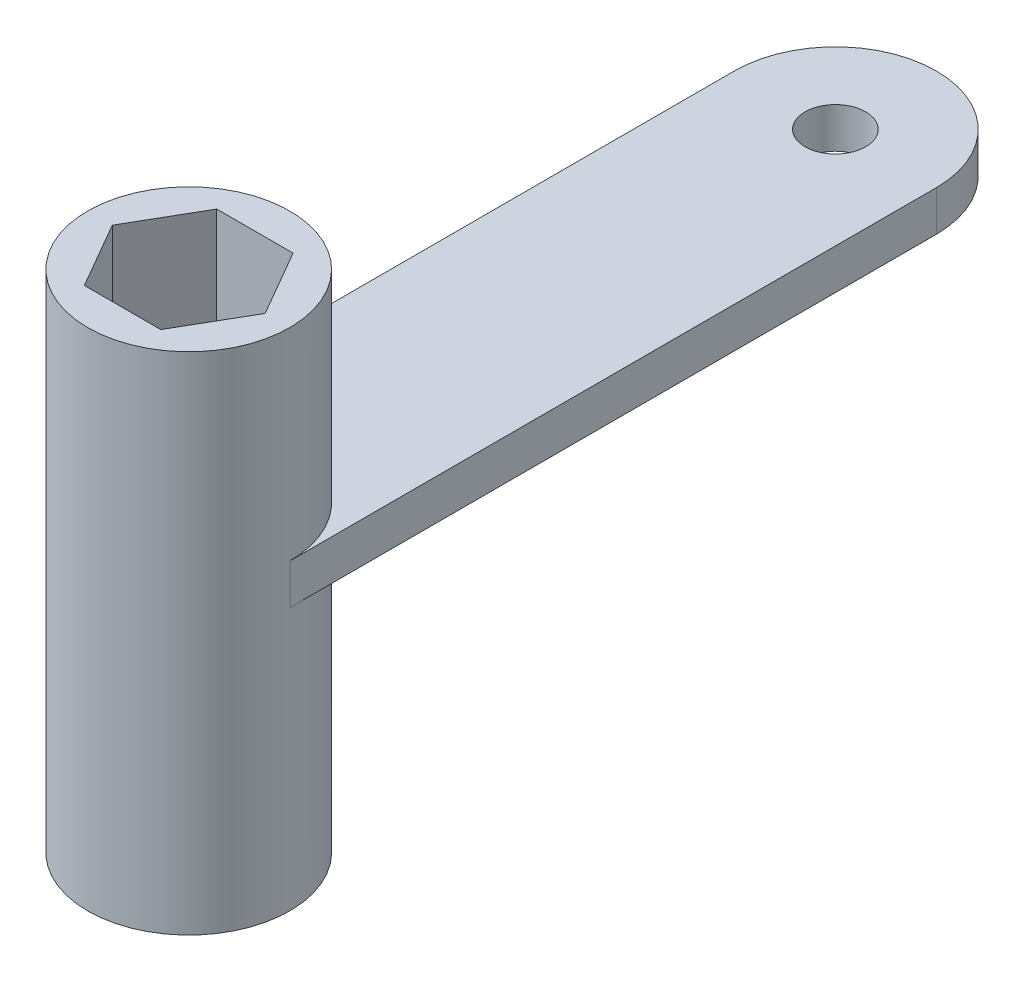
ISO-10303-21;
HEADER;
FILE_DESCRIPTION(('STEP AP214'),'2;1');
FILE_NAME('part.step','',(''),(''),'','','');
FILE_SCHEMA(('AUTOMOTIVE_DESIGN { 1 0 10303 214 1 1 1 1 }'));
ENDSEC;
DATA;
#1=APPLICATION_CONTEXT('core data for automotive mechanical design processes');
#2=APPLICATION_PROTOCOL_DEFINITION('international standard','automotive_design',2000,#1);
#3=PRODUCT_CONTEXT('',#1,'mechanical');
#4=PRODUCT('Part','Part','',(#3));
#5=PRODUCT_RELATED_PRODUCT_CATEGORY('part','',(#4));
#6=PRODUCT_DEFINITION_FORMATION('','',#4);
#7=PRODUCT_DEFINITION_CONTEXT('part definition',#1,'design');
#8=PRODUCT_DEFINITION('design','',#6,#7);
#9=PRODUCT_DEFINITION_SHAPE('','',#8);
#10=(LENGTH_UNIT() NAMED_UNIT(*) SI_UNIT(.MILLI.,.METRE.));
#11=(NAMED_UNIT(*) PLANE_ANGLE_UNIT() SI_UNIT($,.RADIAN.));
#12=(NAMED_UNIT(*) SI_UNIT($,.STERADIAN.) SOLID_ANGLE_UNIT());
#13=UNCERTAINTY_MEASURE_WITH_UNIT(LENGTH_MEASURE(1.E-05),#10,'distance_accuracy_value','');
#14=(GEOMETRIC_REPRESENTATION_CONTEXT(3) GLOBAL_UNCERTAINTY_ASSIGNED_CONTEXT((#13)) GLOBAL_UNIT_ASSIGNED_CONTEXT((#10,
#11,#12)) REPRESENTATION_CONTEXT('',''));
#15=CARTESIAN_POINT('',(0.,0.,0.));
#16=DIRECTION('',(0.,0.,1.));
#17=DIRECTION('',(1.,0.,0.));
#18=AXIS2_PLACEMENT_3D('',#15,#16,#17);
#19=CARTESIAN_POINT('',(3.78164426319206,2.,16.));
#20=DIRECTION('',(-0.866025403784439,0.,0.5));
#21=DIRECTION('',(0.5,0.,0.866025403784439));
#22=AXIS2_PLACEMENT_3D('',#19,#20,#21);
#23=PLANE('',#22);
#24=DIRECTION('',(0.,-1.,0.));
#25=VECTOR('',#24,1.);
#26=CARTESIAN_POINT('',(1.89082213159603,2.,12.725));
#27=LINE('',#26,#25);
#28=CARTESIAN_POINT('',(1.89082213159603,12.,12.725));
#29=VERTEX_POINT('',#28);
#30=CARTESIAN_POINT('',(1.89082213159603,-5.2,12.725));
#31=VERTEX_POINT('',#30);
#32=EDGE_CURVE('E140',#29,#31,#27,.T.);
#33=ORIENTED_EDGE('',*,*,#32,.T.);
#34=DIRECTION('',(-0.5,0.,-0.866025403784439));
#35=VECTOR('',#34,1.);
#36=CARTESIAN_POINT('',(-4.09197003288147,-5.2,2.3625));
#37=LINE('',#36,#35);
#38=CARTESIAN_POINT('',(3.78164426319206,-5.2,16.));
#39=VERTEX_POINT('',#38);
#40=EDGE_CURVE('E125',#39,#31,#37,.T.);
#41=ORIENTED_EDGE('',*,*,#40,.F.);
#42=DIRECTION('',(0.,-1.,0.));
#43=VECTOR('',#42,1.);
#44=CARTESIAN_POINT('',(3.78164426319206,2.,16.));
#45=LINE('',#44,#43);
#46=CARTESIAN_POINT('',(3.78164426319206,12.,16.));
#47=VERTEX_POINT('',#46);
#48=EDGE_CURVE('E208',#47,#39,#45,.T.);
#49=ORIENTED_EDGE('',*,*,#48,.F.);
#50=DIRECTION('',(-0.5,0.,-0.866025403784439));
#51=VECTOR('',#50,1.);
#52=CARTESIAN_POINT('',(3.78164426319206,12.,16.));
#53=LINE('',#52,#51);
#54=EDGE_CURVE('E147',#47,#29,#53,.T.);
#55=ORIENTED_EDGE('',*,*,#54,.T.);
#56=EDGE_LOOP('',(#33,#41,#49,#55));
#57=FACE_BOUND('',#56,.T.);
#58=ADVANCED_FACE('F39',(#57),#23,.T.);
#59=CARTESIAN_POINT('',(1.89082213159603,2.,12.725));
#60=DIRECTION('',(0.,0.,1.));
#61=DIRECTION('',(1.,0.,0.));
#62=AXIS2_PLACEMENT_3D('',#59,#60,#61);
#63=PLANE('',#62);
#64=DIRECTION('',(0.,-1.,0.));
#65=VECTOR('',#64,1.);
#66=CARTESIAN_POINT('',(-1.89082213159602,2.,12.725));
#67=LINE('',#66,#65);
#68=CARTESIAN_POINT('',(-1.89082213159602,12.,12.725));
#69=VERTEX_POINT('',#68);
#70=CARTESIAN_POINT('',(-1.89082213159602,-5.2,12.725));
#71=VERTEX_POINT('',#70);
#72=EDGE_CURVE('E142',#69,#71,#67,.T.);
#73=ORIENTED_EDGE('',*,*,#72,.T.);
#74=DIRECTION('',(-1.,0.,0.));
#75=VECTOR('',#74,1.);
#76=CARTESIAN_POINT('',(0.,-5.2,12.725));
#77=LINE('',#76,#75);
#78=EDGE_CURVE('E128',#31,#71,#77,.T.);
#79=ORIENTED_EDGE('',*,*,#78,.F.);
#80=ORIENTED_EDGE('',*,*,#32,.F.);
#81=DIRECTION('',(-1.,0.,0.));
#82=VECTOR('',#81,1.);
#83=CARTESIAN_POINT('',(1.89082213159603,12.,12.725));
#84=LINE('',#83,#82);
#85=EDGE_CURVE('E258',#29,#69,#84,.T.);
#86=ORIENTED_EDGE('',*,*,#85,.T.);
#87=EDGE_LOOP('',(#73,#79,#80,#86));
#88=FACE_BOUND('',#87,.T.);
#89=ADVANCED_FACE('F138',(#88),#63,.T.);
#90=CARTESIAN_POINT('',(-1.89082213159602,2.,12.725));
#91=DIRECTION('',(0.866025403784439,0.,0.5));
#92=DIRECTION('',(0.5,0.,-0.866025403784439));
#93=AXIS2_PLACEMENT_3D('',#90,#91,#92);
#94=PLANE('',#93);
#95=DIRECTION('',(0.,-1.,0.));
#96=VECTOR('',#95,1.);
#97=CARTESIAN_POINT('',(-3.78164426319204,2.,16.));
#98=LINE('',#97,#96);
#99=CARTESIAN_POINT('',(-3.78164426319204,12.,16.));
#100=VERTEX_POINT('',#99);
#101=CARTESIAN_POINT('',(-3.78164426319204,-5.2,16.));
#102=VERTEX_POINT('',#101);
#103=EDGE_CURVE('E157',#100,#102,#98,.T.);
#104=ORIENTED_EDGE('',*,*,#103,.T.);
#105=DIRECTION('',(-0.5,0.,0.866025403784439));
#106=VECTOR('',#105,1.);
#107=CARTESIAN_POINT('',(4.09197003288147,-5.2,2.3625));
#108=LINE('',#107,#106);
#109=EDGE_CURVE('E228',#71,#102,#108,.T.);
#110=ORIENTED_EDGE('',*,*,#109,.F.);
#111=ORIENTED_EDGE('',*,*,#72,.F.);
#112=DIRECTION('',(-0.5,0.,0.866025403784439));
#113=VECTOR('',#112,1.);
#114=CARTESIAN_POINT('',(-1.89082213159602,12.,12.725));
#115=LINE('',#114,#113);
#116=EDGE_CURVE('E230',#69,#100,#115,.T.);
#117=ORIENTED_EDGE('',*,*,#116,.T.);
#118=EDGE_LOOP('',(#104,#110,#111,#117));
#119=FACE_BOUND('',#118,.T.);
#120=ADVANCED_FACE('F227',(#119),#94,.T.);
#121=CARTESIAN_POINT('',(-3.78164426319204,2.,16.));
#122=DIRECTION('',(0.866025403784439,0.,-0.5));
#123=DIRECTION('',(-0.5,0.,-0.866025403784438));
#124=AXIS2_PLACEMENT_3D('',#121,#122,#123);
#125=PLANE('',#124);
#126=DIRECTION('',(0.,-1.,0.));
#127=VECTOR('',#126,1.);
#128=CARTESIAN_POINT('',(-1.89082213159602,2.,19.275));
#129=LINE('',#128,#127);
#130=CARTESIAN_POINT('',(-1.89082213159602,12.,19.275));
#131=VERTEX_POINT('',#130);
#132=CARTESIAN_POINT('',(-1.89082213159602,-5.2,19.275));
#133=VERTEX_POINT('',#132);
#134=EDGE_CURVE('E220',#131,#133,#129,.T.);
#135=ORIENTED_EDGE('',*,*,#134,.T.);
#136=DIRECTION('',(0.5,0.,0.866025403784439));
#137=VECTOR('',#136,1.);
#138=CARTESIAN_POINT('',(-9.76443642766954,-5.2,5.6375));
#139=LINE('',#138,#137);
#140=EDGE_CURVE('E237',#102,#133,#139,.T.);
#141=ORIENTED_EDGE('',*,*,#140,.F.);
#142=ORIENTED_EDGE('',*,*,#103,.F.);
#143=DIRECTION('',(0.5,0.,0.866025403784438));
#144=VECTOR('',#143,1.);
#145=CARTESIAN_POINT('',(-3.78164426319204,12.,16.));
#146=LINE('',#145,#144);
#147=EDGE_CURVE('E211',#100,#131,#146,.T.);
#148=ORIENTED_EDGE('',*,*,#147,.T.);
#149=EDGE_LOOP('',(#135,#141,#142,#148));
#150=FACE_BOUND('',#149,.T.);
#151=ADVANCED_FACE('F235',(#150),#125,.T.);
#152=CARTESIAN_POINT('',(-1.89082213159602,2.,19.275));
#153=DIRECTION('',(0.,0.,-1.));
#154=DIRECTION('',(-1.,0.,0.));
#155=AXIS2_PLACEMENT_3D('',#152,#153,#154);
#156=PLANE('',#155);
#157=DIRECTION('',(0.,-1.,0.));
#158=VECTOR('',#157,1.);
#159=CARTESIAN_POINT('',(1.89082213159603,2.,19.275));
#160=LINE('',#159,#158);
#161=CARTESIAN_POINT('',(1.89082213159603,12.,19.275));
#162=VERTEX_POINT('',#161);
#163=CARTESIAN_POINT('',(1.89082213159603,-5.2,19.275));
#164=VERTEX_POINT('',#163);
#165=EDGE_CURVE('E216',#162,#164,#160,.T.);
#166=ORIENTED_EDGE('',*,*,#165,.T.);
#167=DIRECTION('',(1.,0.,0.));
#168=VECTOR('',#167,1.);
#169=CARTESIAN_POINT('',(0.,-5.2,19.275));
#170=LINE('',#169,#168);
#171=EDGE_CURVE('E55',#133,#164,#170,.T.);
#172=ORIENTED_EDGE('',*,*,#171,.F.);
#173=ORIENTED_EDGE('',*,*,#134,.F.);
#174=DIRECTION('',(1.,0.,0.));
#175=VECTOR('',#174,1.);
#176=CARTESIAN_POINT('',(-1.89082213159602,12.,19.275));
#177=LINE('',#176,#175);
#178=EDGE_CURVE('E203',#131,#162,#177,.T.);
#179=ORIENTED_EDGE('',*,*,#178,.T.);
#180=EDGE_LOOP('',(#166,#172,#173,#179));
#181=FACE_BOUND('',#180,.T.);
#182=ADVANCED_FACE('F268',(#181),#156,.T.);
#183=CARTESIAN_POINT('',(1.89082213159603,2.,19.275));
#184=DIRECTION('',(-0.866025403784439,0.,-0.5));
#185=DIRECTION('',(-0.5,0.,0.866025403784439));
#186=AXIS2_PLACEMENT_3D('',#183,#184,#185);
#187=PLANE('',#186);
#188=ORIENTED_EDGE('',*,*,#48,.T.);
#189=DIRECTION('',(0.5,0.,-0.866025403784439));
#190=VECTOR('',#189,1.);
#191=CARTESIAN_POINT('',(9.76443642766955,-5.2,5.6375));
#192=LINE('',#191,#190);
#193=EDGE_CURVE('E130',#164,#39,#192,.T.);
#194=ORIENTED_EDGE('',*,*,#193,.F.);
#195=ORIENTED_EDGE('',*,*,#165,.F.);
#196=DIRECTION('',(0.5,0.,-0.866025403784439));
#197=VECTOR('',#196,1.);
#198=CARTESIAN_POINT('',(1.89082213159603,12.,19.275));
#199=LINE('',#198,#197);
#200=EDGE_CURVE('E252',#162,#47,#199,.T.);
#201=ORIENTED_EDGE('',*,*,#200,.T.);
#202=EDGE_LOOP('',(#188,#194,#195,#201));
#203=FACE_BOUND('',#202,.T.);
#204=ADVANCED_FACE('F270',(#203),#187,.T.);
#205=CARTESIAN_POINT('',(0.,2.,16.));
#206=DIRECTION('',(0.,1.,0.));
#207=DIRECTION('',(0.,0.,1.));
#208=AXIS2_PLACEMENT_3D('',#205,#206,#207);
#209=PLANE('',#208);
#210=CARTESIAN_POINT('',(0.,2.,16.));
#211=DIRECTION('',(0.,1.,0.));
#212=DIRECTION('',(0.,0.,1.));
#213=AXIS2_PLACEMENT_3D('',#210,#211,#212);
#214=CIRCLE('',#213,4.99999999999999);
#215=CARTESIAN_POINT('',(4.99999999999999,2.,16.));
#216=VERTEX_POINT('',#215);
#217=CARTESIAN_POINT('',(-4.99999999999999,2.,16.));
#218=VERTEX_POINT('',#217);
#219=EDGE_CURVE('E200',#216,#218,#214,.T.);
#220=ORIENTED_EDGE('',*,*,#219,.F.);
#221=DIRECTION('',(0.,0.,-1.));
#222=VECTOR('',#221,1.);
#223=CARTESIAN_POINT('',(4.99999999999999,2.,16.));
#224=LINE('',#223,#222);
#225=CARTESIAN_POINT('',(4.99999999999999,2.,-16.));
#226=VERTEX_POINT('',#225);
#227=EDGE_CURVE('E86',#216,#226,#224,.T.);
#228=ORIENTED_EDGE('',*,*,#227,.T.);
#229=CARTESIAN_POINT('',(0.,2.,-16.));
#230=DIRECTION('',(0.,1.,0.));
#231=DIRECTION('',(0.,0.,1.));
#232=AXIS2_PLACEMENT_3D('',#229,#230,#231);
#233=CIRCLE('',#232,4.99999999999999);
#234=CARTESIAN_POINT('',(-5.,2.,-16.));
#235=VERTEX_POINT('',#234);
#236=EDGE_CURVE('E167',#226,#235,#233,.T.);
#237=ORIENTED_EDGE('',*,*,#236,.T.);
#238=DIRECTION('',(0.,0.,1.));
#239=VECTOR('',#238,1.);
#240=CARTESIAN_POINT('',(-4.99999999999999,2.,16.));
#241=LINE('',#240,#239);
#242=EDGE_CURVE('E64',#235,#218,#241,.T.);
#243=ORIENTED_EDGE('',*,*,#242,.T.);
#244=EDGE_LOOP('',(#220,#228,#237,#243));
#245=FACE_BOUND('',#244,.T.);
#246=CARTESIAN_POINT('',(0.,2.,-16.));
#247=DIRECTION('',(0.,1.,0.));
#248=DIRECTION('',(0.,0.,1.));
#249=AXIS2_PLACEMENT_3D('',#246,#247,#248);
#250=CIRCLE('',#249,1.5);
#251=CARTESIAN_POINT('',(0.,2.,-14.5));
#252=VERTEX_POINT('',#251);
#253=EDGE_CURVE('E155',#252,#252,#250,.T.);
#254=ORIENTED_EDGE('',*,*,#253,.F.);
#255=EDGE_LOOP('',(#254));
#256=FACE_BOUND('',#255,.T.);
#257=ADVANCED_FACE('F304',(#245,#256),#209,.T.);
#258=CARTESIAN_POINT('',(0.,0.,16.));
#259=DIRECTION('',(0.,1.,0.));
#260=DIRECTION('',(0.,0.,1.));
#261=AXIS2_PLACEMENT_3D('',#258,#259,#260);
#262=PLANE('',#261);
#263=CARTESIAN_POINT('',(0.,0.,-16.));
#264=DIRECTION('',(0.,1.,0.));
#265=DIRECTION('',(0.,0.,1.));
#266=AXIS2_PLACEMENT_3D('',#263,#264,#265);
#267=CIRCLE('',#266,1.5);
#268=CARTESIAN_POINT('',(0.,0.,-14.5));
#269=VERTEX_POINT('',#268);
#270=EDGE_CURVE('E150',#269,#269,#267,.T.);
#271=ORIENTED_EDGE('',*,*,#270,.T.);
#272=EDGE_LOOP('',(#271));
#273=FACE_BOUND('',#272,.T.);
#274=DIRECTION('',(0.,0.,-1.));
#275=VECTOR('',#274,1.);
#276=CARTESIAN_POINT('',(4.99999999999999,0.,16.));
#277=LINE('',#276,#275);
#278=CARTESIAN_POINT('',(4.99999999999999,0.,16.));
#279=VERTEX_POINT('',#278);
#280=CARTESIAN_POINT('',(4.99999999999999,0.,-16.));
#281=VERTEX_POINT('',#280);
#282=EDGE_CURVE('E163',#279,#281,#277,.T.);
#283=ORIENTED_EDGE('',*,*,#282,.F.);
#284=CARTESIAN_POINT('',(0.,0.,16.));
#285=DIRECTION('',(0.,1.,0.));
#286=DIRECTION('',(0.,0.,1.));
#287=AXIS2_PLACEMENT_3D('',#284,#285,#286);
#288=CIRCLE('',#287,4.99999999999999);
#289=CARTESIAN_POINT('',(-4.99999999999999,0.,16.));
#290=VERTEX_POINT('',#289);
#291=EDGE_CURVE('E194',#279,#290,#288,.T.);
#292=ORIENTED_EDGE('',*,*,#291,.T.);
#293=DIRECTION('',(0.,0.,1.));
#294=VECTOR('',#293,1.);
#295=CARTESIAN_POINT('',(-4.99999999999999,0.,16.));
#296=LINE('',#295,#294);
#297=CARTESIAN_POINT('',(-5.,0.,-16.));
#298=VERTEX_POINT('',#297);
#299=EDGE_CURVE('E168',#298,#290,#296,.T.);
#300=ORIENTED_EDGE('',*,*,#299,.F.);
#301=CARTESIAN_POINT('',(0.,0.,-16.));
#302=DIRECTION('',(0.,1.,0.));
#303=DIRECTION('',(0.,0.,1.));
#304=AXIS2_PLACEMENT_3D('',#301,#302,#303);
#305=CIRCLE('',#304,4.99999999999999);
#306=EDGE_CURVE('E82',#281,#298,#305,.T.);
#307=ORIENTED_EDGE('',*,*,#306,.F.);
#308=EDGE_LOOP('',(#283,#292,#300,#307));
#309=FACE_BOUND('',#308,.T.);
#310=ADVANCED_FACE('F193',(#273,#309),#262,.F.);
#311=CARTESIAN_POINT('',(0.,2.,16.));
#312=DIRECTION('',(0.,-1.,0.));
#313=DIRECTION('',(0.,0.,-1.));
#314=AXIS2_PLACEMENT_3D('',#311,#312,#313);
#315=CYLINDRICAL_SURFACE('',#314,4.99999999999999);
#316=DIRECTION('',(0.,-1.,0.));
#317=VECTOR('',#316,1.);
#318=CARTESIAN_POINT('',(-4.99999999999999,2.,16.));
#319=LINE('',#318,#317);
#320=EDGE_CURVE('E173',#218,#290,#319,.T.);
#321=ORIENTED_EDGE('',*,*,#320,.T.);
#322=ORIENTED_EDGE('',*,*,#291,.F.);
#323=DIRECTION('',(0.,-1.,0.));
#324=VECTOR('',#323,1.);
#325=CARTESIAN_POINT('',(4.99999999999999,2.,16.));
#326=LINE('',#325,#324);
#327=EDGE_CURVE('E11',#216,#279,#326,.T.);
#328=ORIENTED_EDGE('',*,*,#327,.F.);
#329=ORIENTED_EDGE('',*,*,#219,.T.);
#330=EDGE_LOOP('',(#321,#322,#328,#329));
#331=FACE_BOUND('',#330,.T.);
#332=CARTESIAN_POINT('',(0.,12.,16.));
#333=DIRECTION('',(0.,1.,0.));
#334=DIRECTION('',(0.,0.,1.));
#335=AXIS2_PLACEMENT_3D('',#332,#333,#334);
#336=CIRCLE('',#335,4.99999999999999);
#337=CARTESIAN_POINT('',(0.,12.,21.));
#338=VERTEX_POINT('',#337);
#339=EDGE_CURVE('E202',#338,#338,#336,.T.);
#340=ORIENTED_EDGE('',*,*,#339,.F.);
#341=EDGE_LOOP('',(#340));
#342=FACE_BOUND('',#341,.T.);
#343=CARTESIAN_POINT('',(0.,-13.,16.));
#344=DIRECTION('',(0.,1.,0.));
#345=DIRECTION('',(0.,0.,1.));
#346=AXIS2_PLACEMENT_3D('',#343,#344,#345);
#347=CIRCLE('',#346,4.99999999999999);
#348=CARTESIAN_POINT('',(0.,-13.,21.));
#349=VERTEX_POINT('',#348);
#350=EDGE_CURVE('E242',#349,#349,#347,.T.);
#351=ORIENTED_EDGE('',*,*,#350,.T.);
#352=EDGE_LOOP('',(#351));
#353=FACE_BOUND('',#352,.T.);
#354=ADVANCED_FACE('F41',(#331,#342,#353),#315,.T.);
#355=CARTESIAN_POINT('',(4.99999999999999,2.,16.));
#356=DIRECTION('',(-1.,0.,0.));
#357=DIRECTION('',(0.,0.,1.));
#358=AXIS2_PLACEMENT_3D('',#355,#356,#357);
#359=PLANE('',#358);
#360=ORIENTED_EDGE('',*,*,#282,.T.);
#361=DIRECTION('',(0.,-1.,0.));
#362=VECTOR('',#361,1.);
#363=CARTESIAN_POINT('',(4.99999999999999,2.,-16.));
#364=LINE('',#363,#362);
#365=EDGE_CURVE('E48',#226,#281,#364,.T.);
#366=ORIENTED_EDGE('',*,*,#365,.F.);
#367=ORIENTED_EDGE('',*,*,#227,.F.);
#368=ORIENTED_EDGE('',*,*,#327,.T.);
#369=EDGE_LOOP('',(#360,#366,#367,#368));
#370=FACE_BOUND('',#369,.T.);
#371=ADVANCED_FACE('F313',(#370),#359,.F.);
#372=CARTESIAN_POINT('',(0.,2.,-16.));
#373=DIRECTION('',(0.,-1.,0.));
#374=DIRECTION('',(0.,0.,-1.));
#375=AXIS2_PLACEMENT_3D('',#372,#373,#374);
#376=CYLINDRICAL_SURFACE('',#375,4.99999999999999);
#377=ORIENTED_EDGE('',*,*,#306,.T.);
#378=DIRECTION('',(0.,-1.,0.));
#379=VECTOR('',#378,1.);
#380=CARTESIAN_POINT('',(-5.,2.,-16.));
#381=LINE('',#380,#379);
#382=EDGE_CURVE('E184',#235,#298,#381,.T.);
#383=ORIENTED_EDGE('',*,*,#382,.F.);
#384=ORIENTED_EDGE('',*,*,#236,.F.);
#385=ORIENTED_EDGE('',*,*,#365,.T.);
#386=EDGE_LOOP('',(#377,#383,#384,#385));
#387=FACE_BOUND('',#386,.T.);
#388=ADVANCED_FACE('F188',(#387),#376,.T.);
#389=CARTESIAN_POINT('',(-4.99999999999999,2.,16.));
#390=DIRECTION('',(1.,0.,0.));
#391=DIRECTION('',(0.,0.,-1.));
#392=AXIS2_PLACEMENT_3D('',#389,#390,#391);
#393=PLANE('',#392);
#394=ORIENTED_EDGE('',*,*,#299,.T.);
#395=ORIENTED_EDGE('',*,*,#320,.F.);
#396=ORIENTED_EDGE('',*,*,#242,.F.);
#397=ORIENTED_EDGE('',*,*,#382,.T.);
#398=EDGE_LOOP('',(#394,#395,#396,#397));
#399=FACE_BOUND('',#398,.T.);
#400=ADVANCED_FACE('F196',(#399),#393,.F.);
#401=CARTESIAN_POINT('',(0.,2.,-16.));
#402=DIRECTION('',(0.,-1.,0.));
#403=DIRECTION('',(0.,0.,-1.));
#404=AXIS2_PLACEMENT_3D('',#401,#402,#403);
#405=CYLINDRICAL_SURFACE('',#404,1.5);
#406=ORIENTED_EDGE('',*,*,#253,.T.);
#407=EDGE_LOOP('',(#406));
#408=FACE_BOUND('',#407,.T.);
#409=ORIENTED_EDGE('',*,*,#270,.F.);
#410=EDGE_LOOP('',(#409));
#411=FACE_BOUND('',#410,.T.);
#412=ADVANCED_FACE('F300',(#408,#411),#405,.F.);
#413=CARTESIAN_POINT('',(0.,12.,16.));
#414=DIRECTION('',(0.,1.,0.));
#415=DIRECTION('',(0.,0.,1.));
#416=AXIS2_PLACEMENT_3D('',#413,#414,#415);
#417=PLANE('',#416);
#418=ORIENTED_EDGE('',*,*,#339,.T.);
#419=EDGE_LOOP('',(#418));
#420=FACE_BOUND('',#419,.T.);
#421=ORIENTED_EDGE('',*,*,#54,.F.);
#422=ORIENTED_EDGE('',*,*,#200,.F.);
#423=ORIENTED_EDGE('',*,*,#178,.F.);
#424=ORIENTED_EDGE('',*,*,#147,.F.);
#425=ORIENTED_EDGE('',*,*,#116,.F.);
#426=ORIENTED_EDGE('',*,*,#85,.F.);
#427=EDGE_LOOP('',(#421,#422,#423,#424,#425,#426));
#428=FACE_BOUND('',#427,.T.);
#429=ADVANCED_FACE('F265',(#420,#428),#417,.T.);
#430=CARTESIAN_POINT('',(0.,-13.,16.));
#431=DIRECTION('',(0.,1.,0.));
#432=DIRECTION('',(0.,0.,1.));
#433=AXIS2_PLACEMENT_3D('',#430,#431,#432);
#434=PLANE('',#433);
#435=ORIENTED_EDGE('',*,*,#350,.F.);
#436=EDGE_LOOP('',(#435));
#437=FACE_BOUND('',#436,.T.);
#438=ADVANCED_FACE('F327',(#437),#434,.F.);
#439=CARTESIAN_POINT('',(0.,-5.2,0.));
#440=DIRECTION('',(0.,-1.,0.));
#441=DIRECTION('',(0.,0.,-1.));
#442=AXIS2_PLACEMENT_3D('',#439,#440,#441);
#443=PLANE('',#442);
#444=CARTESIAN_POINT('',(0.,-5.2,16.));
#445=DIRECTION('',(0.,-1.,0.));
#446=DIRECTION('',(0.,0.,-1.));
#447=AXIS2_PLACEMENT_3D('',#444,#445,#446);
#448=CIRCLE('',#447,1.6);
#449=CARTESIAN_POINT('',(0.,-5.2,14.4));
#450=VERTEX_POINT('',#449);
#451=EDGE_CURVE('E273',#450,#450,#448,.T.);
#452=ORIENTED_EDGE('',*,*,#451,.T.);
#453=EDGE_LOOP('',(#452));
#454=FACE_BOUND('',#453,.T.);
#455=ORIENTED_EDGE('',*,*,#78,.T.);
#456=ORIENTED_EDGE('',*,*,#109,.T.);
#457=ORIENTED_EDGE('',*,*,#140,.T.);
#458=ORIENTED_EDGE('',*,*,#171,.T.);
#459=ORIENTED_EDGE('',*,*,#193,.T.);
#460=ORIENTED_EDGE('',*,*,#40,.T.);
#461=EDGE_LOOP('',(#455,#456,#457,#458,#459,#460));
#462=FACE_BOUND('',#461,.T.);
#463=ADVANCED_FACE('F127',(#454,#462),#443,.F.);
#464=CARTESIAN_POINT('',(0.,-0.200000000000001,16.));
#465=DIRECTION('',(0.,-1.,0.));
#466=DIRECTION('',(0.,0.,-1.));
#467=AXIS2_PLACEMENT_3D('',#464,#465,#466);
#468=CYLINDRICAL_SURFACE('',#467,1.6);
#469=CARTESIAN_POINT('',(0.,-0.200000000000001,16.));
#470=DIRECTION('',(0.,-1.,0.));
#471=DIRECTION('',(0.,0.,-1.));
#472=AXIS2_PLACEMENT_3D('',#469,#470,#471);
#473=CIRCLE('',#472,1.6);
#474=CARTESIAN_POINT('',(0.,-0.200000000000001,14.4));
#475=VERTEX_POINT('',#474);
#476=EDGE_CURVE('E144',#475,#475,#473,.T.);
#477=ORIENTED_EDGE('',*,*,#476,.T.);
#478=EDGE_LOOP('',(#477));
#479=FACE_BOUND('',#478,.T.);
#480=ORIENTED_EDGE('',*,*,#451,.F.);
#481=EDGE_LOOP('',(#480));
#482=FACE_BOUND('',#481,.T.);
#483=ADVANCED_FACE('F281',(#479,#482),#468,.T.);
#484=CARTESIAN_POINT('',(0.,-0.200000000000001,16.));
#485=DIRECTION('',(0.,-1.,0.));
#486=DIRECTION('',(0.,0.,-1.));
#487=AXIS2_PLACEMENT_3D('',#484,#485,#486);
#488=PLANE('',#487);
#489=ORIENTED_EDGE('',*,*,#476,.F.);
#490=EDGE_LOOP('',(#489));
#491=FACE_BOUND('',#490,.T.);
#492=ADVANCED_FACE('F284',(#491),#488,.F.);
#493=CLOSED_SHELL('',(#58,#89,#120,#151,#182,#204,#257,#310,#354,#371,#388,#400,#412,#429,#438,
#463,#483,#492));
#494=MANIFOLD_SOLID_BREP('B2',#493);
#495=ADVANCED_BREP_SHAPE_REPRESENTATION('',(#18,#494),#14);
#496=SHAPE_DEFINITION_REPRESENTATION(#9,#495);
ENDSEC;
END-ISO-10303-21;
